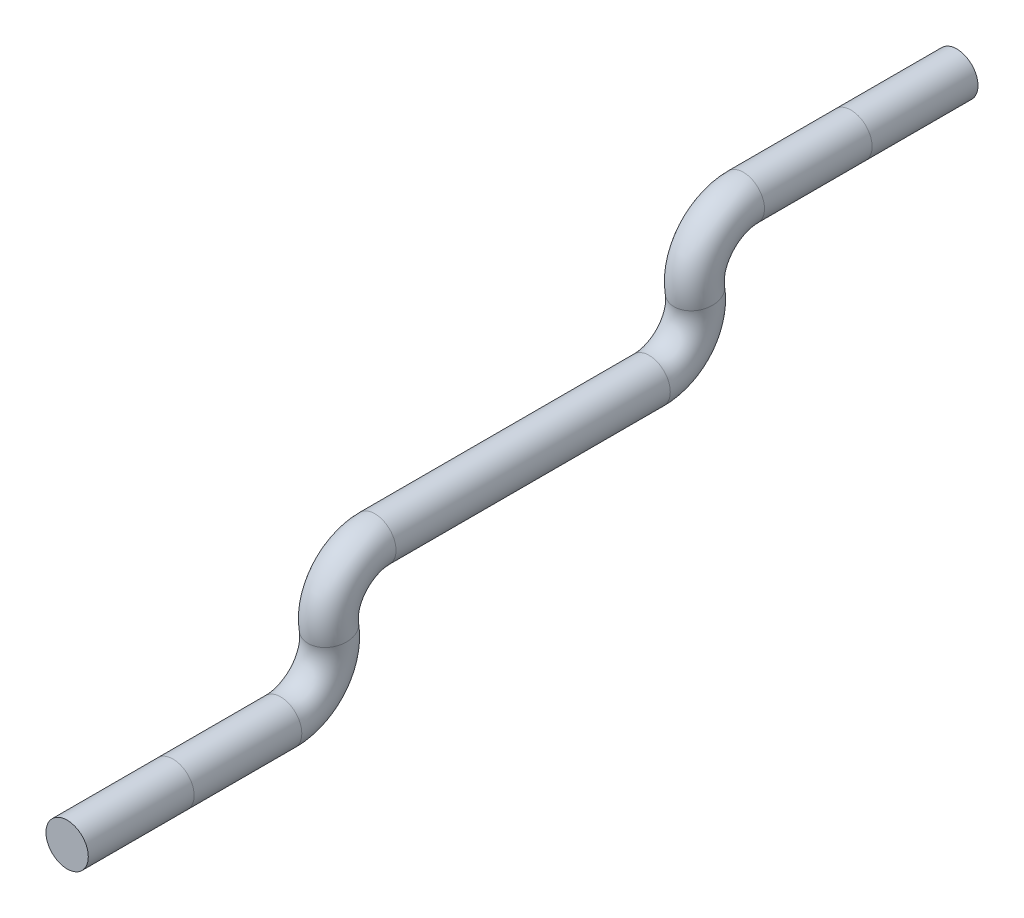
ISO-10303-21;
HEADER;
FILE_DESCRIPTION(('STEP AP214'),'2;1');
FILE_NAME('part.step','',(''),(''),'','','');
FILE_SCHEMA(('AUTOMOTIVE_DESIGN { 1 0 10303 214 1 1 1 1 }'));
ENDSEC;
DATA;
#1=APPLICATION_CONTEXT('core data for automotive mechanical design processes');
#2=APPLICATION_PROTOCOL_DEFINITION('international standard','automotive_design',2000,#1);
#3=PRODUCT_CONTEXT('',#1,'mechanical');
#4=PRODUCT('Part','Part','',(#3));
#5=PRODUCT_RELATED_PRODUCT_CATEGORY('part','',(#4));
#6=PRODUCT_DEFINITION_FORMATION('','',#4);
#7=PRODUCT_DEFINITION_CONTEXT('part definition',#1,'design');
#8=PRODUCT_DEFINITION('design','',#6,#7);
#9=PRODUCT_DEFINITION_SHAPE('','',#8);
#10=(LENGTH_UNIT() NAMED_UNIT(*) SI_UNIT(.MILLI.,.METRE.));
#11=(NAMED_UNIT(*) PLANE_ANGLE_UNIT() SI_UNIT($,.RADIAN.));
#12=(NAMED_UNIT(*) SI_UNIT($,.STERADIAN.) SOLID_ANGLE_UNIT());
#13=UNCERTAINTY_MEASURE_WITH_UNIT(LENGTH_MEASURE(1.E-05),#10,'distance_accuracy_value','');
#14=(GEOMETRIC_REPRESENTATION_CONTEXT(3) GLOBAL_UNCERTAINTY_ASSIGNED_CONTEXT((#13)) GLOBAL_UNIT_ASSIGNED_CONTEXT((#10,
#11,#12)) REPRESENTATION_CONTEXT('',''));
#15=CARTESIAN_POINT('',(0.,0.,0.));
#16=DIRECTION('',(0.,0.,1.));
#17=DIRECTION('',(1.,0.,0.));
#18=AXIS2_PLACEMENT_3D('',#15,#16,#17);
#19=CARTESIAN_POINT('',(0.,52.6742463027058,-210.124764733969));
#20=DIRECTION('',(0.,0.,1.));
#21=DIRECTION('',(1.,0.,0.));
#22=AXIS2_PLACEMENT_3D('',#19,#20,#21);
#23=PLANE('',#22);
#24=CARTESIAN_POINT('',(0.,52.6742463027058,-210.124764733969));
#25=DIRECTION('',(0.,0.,1.));
#26=DIRECTION('',(1.,0.,0.));
#27=AXIS2_PLACEMENT_3D('',#24,#25,#26);
#28=CIRCLE('',#27,10.);
#29=CARTESIAN_POINT('',(10.,52.6742463027058,-210.124764733969));
#30=VERTEX_POINT('',#29);
#31=EDGE_CURVE('E84',#30,#30,#28,.T.);
#32=ORIENTED_EDGE('',*,*,#31,.F.);
#33=EDGE_LOOP('',(#32));
#34=FACE_BOUND('',#33,.T.);
#35=ADVANCED_FACE('F41',(#34),#23,.F.);
#36=CARTESIAN_POINT('',(0.,-52.6742463027058,210.124764733969));
#37=DIRECTION('',(0.,0.,1.));
#38=DIRECTION('',(1.,0.,0.));
#39=AXIS2_PLACEMENT_3D('',#36,#37,#38);
#40=PLANE('',#39);
#41=CARTESIAN_POINT('',(0.,-52.6742463027058,210.124764733969));
#42=DIRECTION('',(0.,0.,1.));
#43=DIRECTION('',(1.,0.,0.));
#44=AXIS2_PLACEMENT_3D('',#41,#42,#43);
#45=CIRCLE('',#44,10.);
#46=CARTESIAN_POINT('',(10.,-52.6742463027058,210.124764733969));
#47=VERTEX_POINT('',#46);
#48=EDGE_CURVE('E10',#47,#47,#45,.T.);
#49=ORIENTED_EDGE('',*,*,#48,.T.);
#50=EDGE_LOOP('',(#49));
#51=FACE_BOUND('',#50,.T.);
#52=ADVANCED_FACE('F92',(#51),#40,.T.);
#53=CARTESIAN_POINT('',(0.,52.6742463027058,-210.124764733969));
#54=DIRECTION('',(0.,0.,1.));
#55=DIRECTION('',(1.,0.,0.));
#56=AXIS2_PLACEMENT_3D('',#53,#54,#55);
#57=CYLINDRICAL_SURFACE('',#56,10.);
#58=CARTESIAN_POINT('',(0.,52.6742463027058,-160.124764733969));
#59=DIRECTION('',(0.,0.,1.));
#60=DIRECTION('',(1.,0.,0.));
#61=AXIS2_PLACEMENT_3D('',#58,#59,#60);
#62=CIRCLE('',#61,10.);
#63=CARTESIAN_POINT('',(10.,52.6742463027058,-160.124764733969));
#64=VERTEX_POINT('',#63);
#65=EDGE_CURVE('E80',#64,#64,#62,.T.);
#66=ORIENTED_EDGE('',*,*,#65,.F.);
#67=EDGE_LOOP('',(#66));
#68=FACE_BOUND('',#67,.T.);
#69=ORIENTED_EDGE('',*,*,#31,.T.);
#70=EDGE_LOOP('',(#69));
#71=FACE_BOUND('',#70,.T.);
#72=ADVANCED_FACE('F89',(#68,#71),#57,.T.);
#73=CARTESIAN_POINT('',(0.,52.6742463027058,-160.124764733969));
#74=DIRECTION('',(0.,0.,1.));
#75=DIRECTION('',(1.,0.,0.));
#76=AXIS2_PLACEMENT_3D('',#73,#74,#75);
#77=CYLINDRICAL_SURFACE('',#76,10.);
#78=CARTESIAN_POINT('',(0.,52.6742463027058,-109.274248540974));
#79=DIRECTION('',(0.,0.,1.));
#80=DIRECTION('',(1.,0.,0.));
#81=AXIS2_PLACEMENT_3D('',#78,#79,#80);
#82=CIRCLE('',#81,10.);
#83=CARTESIAN_POINT('',(0.,62.6742463027058,-109.274248540974));
#84=VERTEX_POINT('',#83);
#85=EDGE_CURVE('E76',#84,#84,#82,.T.);
#86=ORIENTED_EDGE('',*,*,#85,.F.);
#87=EDGE_LOOP('',(#86));
#88=FACE_BOUND('',#87,.T.);
#89=ORIENTED_EDGE('',*,*,#65,.T.);
#90=EDGE_LOOP('',(#89));
#91=FACE_BOUND('',#90,.T.);
#92=ADVANCED_FACE('F126',(#88,#91),#77,.T.);
#93=CARTESIAN_POINT('',(0.,29.5151499474392,-109.274248540974));
#94=DIRECTION('',(1.,0.,0.));
#95=DIRECTION('',(0.,0.,-1.));
#96=AXIS2_PLACEMENT_3D('',#93,#94,#95);
#97=TOROIDAL_SURFACE('',#96,23.1590963552666,10.);
#98=CARTESIAN_POINT('',(0.,25.6452190895727,-86.440777951774));
#99=DIRECTION('',(0.,-0.985939616940508,-0.167101980081638));
#100=DIRECTION('',(1.,0.,0.));
#101=AXIS2_PLACEMENT_3D('',#98,#99,#100);
#102=CIRCLE('',#101,10.);
#103=CARTESIAN_POINT('',(0.,23.9741992887563,-76.5813817823689));
#104=VERTEX_POINT('',#103);
#105=EDGE_CURVE('E72',#104,#104,#102,.T.);
#106=CARTESIAN_POINT('',(0.,29.5151499474392,-109.274248540974));
#107=DIRECTION('',(1.,0.,0.));
#108=DIRECTION('',(0.,0.,-1.));
#109=AXIS2_PLACEMENT_3D('',#106,#107,#108);
#110=CIRCLE('',#109,33.1590963552666);
#111=EDGE_CURVE('',#84,#104,#110,.T.);
#112=ORIENTED_EDGE('',*,*,#85,.T.);
#113=ORIENTED_EDGE('',*,*,#105,.F.);
#114=ORIENTED_EDGE('',*,*,#111,.T.);
#115=ORIENTED_EDGE('',*,*,#111,.F.);
#116=EDGE_LOOP('',(#112,#114,#113,#115));
#117=FACE_BOUND('',#116,.T.);
#118=ADVANCED_FACE('F122',(#117),#97,.T.);
#119=CARTESIAN_POINT('',(0.,21.9734175138481,-64.7763151052967));
#120=DIRECTION('',(-1.,0.,0.));
#121=DIRECTION('',(0.,0.,1.));
#122=AXIS2_PLACEMENT_3D('',#119,#120,#121);
#123=TOROIDAL_SURFACE('',#122,21.9734175138481,10.);
#124=CARTESIAN_POINT('',(0.,0.,-64.7763151052967));
#125=DIRECTION('',(0.,0.,1.));
#126=DIRECTION('',(1.,0.,0.));
#127=AXIS2_PLACEMENT_3D('',#124,#125,#126);
#128=CIRCLE('',#127,10.);
#129=CARTESIAN_POINT('',(10.,0.,-64.7763151052967));
#130=VERTEX_POINT('',#129);
#131=EDGE_CURVE('E68',#130,#130,#128,.T.);
#132=ORIENTED_EDGE('',*,*,#131,.F.);
#133=EDGE_LOOP('',(#132));
#134=FACE_BOUND('',#133,.T.);
#135=ORIENTED_EDGE('',*,*,#105,.T.);
#136=EDGE_LOOP('',(#135));
#137=FACE_BOUND('',#136,.T.);
#138=ADVANCED_FACE('F118',(#134,#137),#123,.T.);
#139=CARTESIAN_POINT('',(0.,0.,-64.7763151052967));
#140=DIRECTION('',(0.,0.,1.));
#141=DIRECTION('',(1.,0.,0.));
#142=AXIS2_PLACEMENT_3D('',#139,#140,#141);
#143=CYLINDRICAL_SURFACE('',#142,10.);
#144=CARTESIAN_POINT('',(0.,0.,64.7763151052967));
#145=DIRECTION('',(0.,0.,1.));
#146=DIRECTION('',(1.,0.,0.));
#147=AXIS2_PLACEMENT_3D('',#144,#145,#146);
#148=CIRCLE('',#147,10.);
#149=CARTESIAN_POINT('',(0.,9.99999999999999,64.7763151052967));
#150=VERTEX_POINT('',#149);
#151=EDGE_CURVE('E64',#150,#150,#148,.T.);
#152=ORIENTED_EDGE('',*,*,#151,.F.);
#153=EDGE_LOOP('',(#152));
#154=FACE_BOUND('',#153,.T.);
#155=ORIENTED_EDGE('',*,*,#131,.T.);
#156=EDGE_LOOP('',(#155));
#157=FACE_BOUND('',#156,.T.);
#158=ADVANCED_FACE('F114',(#154,#157),#143,.T.);
#159=CARTESIAN_POINT('',(0.,-21.9734175138481,64.7763151052967));
#160=DIRECTION('',(1.,0.,0.));
#161=DIRECTION('',(0.,0.,-1.));
#162=AXIS2_PLACEMENT_3D('',#159,#160,#161);
#163=TOROIDAL_SURFACE('',#162,21.9734175138481,10.);
#164=CARTESIAN_POINT('',(0.,-25.6452190895727,86.440777951774));
#165=DIRECTION('',(0.,-0.985939616940508,-0.167101980081637));
#166=DIRECTION('',(1.,0.,0.));
#167=AXIS2_PLACEMENT_3D('',#164,#165,#166);
#168=CIRCLE('',#167,10.);
#169=CARTESIAN_POINT('',(0.,-27.3162388903891,96.3001741211791));
#170=VERTEX_POINT('',#169);
#171=EDGE_CURVE('E58',#170,#170,#168,.T.);
#172=CARTESIAN_POINT('',(0.,-21.9734175138481,64.7763151052967));
#173=DIRECTION('',(1.,0.,0.));
#174=DIRECTION('',(0.,0.,-1.));
#175=AXIS2_PLACEMENT_3D('',#172,#173,#174);
#176=CIRCLE('',#175,31.9734175138481);
#177=EDGE_CURVE('',#150,#170,#176,.T.);
#178=ORIENTED_EDGE('',*,*,#151,.T.);
#179=ORIENTED_EDGE('',*,*,#171,.F.);
#180=ORIENTED_EDGE('',*,*,#177,.T.);
#181=ORIENTED_EDGE('',*,*,#177,.F.);
#182=EDGE_LOOP('',(#178,#180,#179,#181));
#183=FACE_BOUND('',#182,.T.);
#184=ADVANCED_FACE('F110',(#183),#163,.T.);
#185=CARTESIAN_POINT('',(0.,-29.5151499474392,109.274248540974));
#186=DIRECTION('',(-1.,0.,0.));
#187=DIRECTION('',(0.,0.,1.));
#188=AXIS2_PLACEMENT_3D('',#185,#186,#187);
#189=TOROIDAL_SURFACE('',#188,23.1590963552666,10.);
#190=CARTESIAN_POINT('',(0.,-52.6742463027056,109.274248540974));
#191=DIRECTION('',(0.,0.,1.));
#192=DIRECTION('',(1.,0.,0.));
#193=AXIS2_PLACEMENT_3D('',#190,#191,#192);
#194=CIRCLE('',#193,10.);
#195=CARTESIAN_POINT('',(10.,-52.6742463027056,109.274248540974));
#196=VERTEX_POINT('',#195);
#197=EDGE_CURVE('E53',#196,#196,#194,.T.);
#198=ORIENTED_EDGE('',*,*,#197,.F.);
#199=EDGE_LOOP('',(#198));
#200=FACE_BOUND('',#199,.T.);
#201=ORIENTED_EDGE('',*,*,#171,.T.);
#202=EDGE_LOOP('',(#201));
#203=FACE_BOUND('',#202,.T.);
#204=ADVANCED_FACE('F104',(#200,#203),#189,.T.);
#205=CARTESIAN_POINT('',(0.,-52.6742463027058,109.274248540974));
#206=DIRECTION('',(0.,0.,1.));
#207=DIRECTION('',(1.,0.,0.));
#208=AXIS2_PLACEMENT_3D('',#205,#206,#207);
#209=CYLINDRICAL_SURFACE('',#208,10.);
#210=CARTESIAN_POINT('',(0.,-52.6742463027058,160.124764733969));
#211=DIRECTION('',(0.,0.,1.));
#212=DIRECTION('',(1.,0.,0.));
#213=AXIS2_PLACEMENT_3D('',#210,#211,#212);
#214=CIRCLE('',#213,10.);
#215=CARTESIAN_POINT('',(10.,-52.6742463027058,160.124764733969));
#216=VERTEX_POINT('',#215);
#217=EDGE_CURVE('E48',#216,#216,#214,.T.);
#218=ORIENTED_EDGE('',*,*,#217,.F.);
#219=EDGE_LOOP('',(#218));
#220=FACE_BOUND('',#219,.T.);
#221=ORIENTED_EDGE('',*,*,#197,.T.);
#222=EDGE_LOOP('',(#221));
#223=FACE_BOUND('',#222,.T.);
#224=ADVANCED_FACE('F98',(#220,#223),#209,.T.);
#225=CARTESIAN_POINT('',(0.,-52.6742463027058,160.124764733969));
#226=DIRECTION('',(0.,0.,1.));
#227=DIRECTION('',(0.,-1.,0.));
#228=AXIS2_PLACEMENT_3D('',#225,#226,#227);
#229=CYLINDRICAL_SURFACE('',#228,10.);
#230=ORIENTED_EDGE('',*,*,#48,.F.);
#231=EDGE_LOOP('',(#230));
#232=FACE_BOUND('',#231,.T.);
#233=ORIENTED_EDGE('',*,*,#217,.T.);
#234=EDGE_LOOP('',(#233));
#235=FACE_BOUND('',#234,.T.);
#236=ADVANCED_FACE('F96',(#232,#235),#229,.T.);
#237=CLOSED_SHELL('',(#35,#52,#72,#92,#118,#138,#158,#184,#204,#224,#236));
#238=MANIFOLD_SOLID_BREP('B2',#237);
#239=ADVANCED_BREP_SHAPE_REPRESENTATION('',(#18,#238),#14);
#240=SHAPE_DEFINITION_REPRESENTATION(#9,#239);
ENDSEC;
END-ISO-10303-21;
